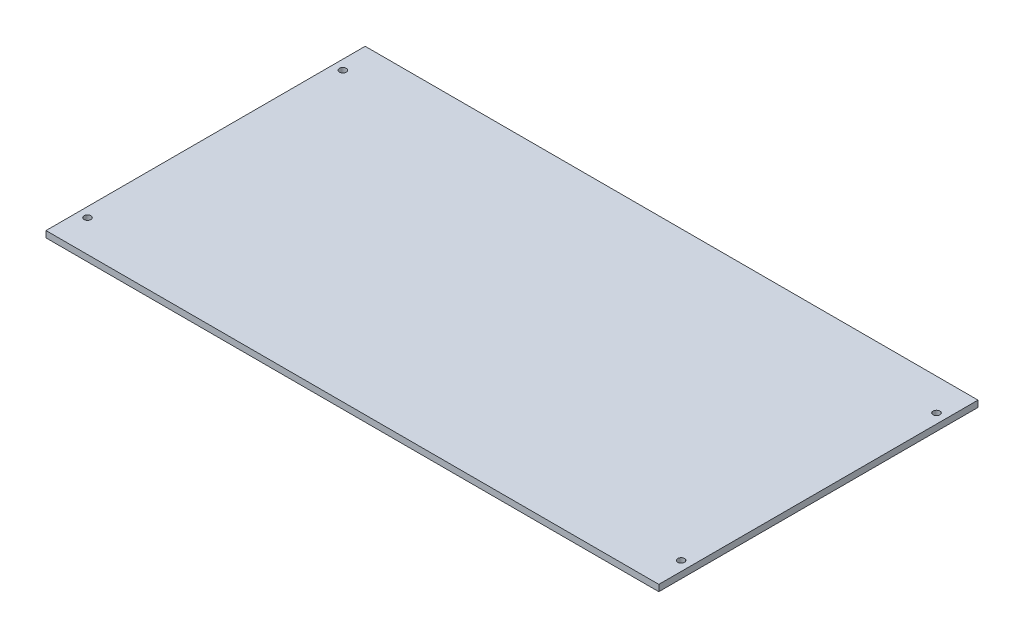
ISO-10303-21;
HEADER;
FILE_DESCRIPTION(('STEP AP214'),'2;1');
FILE_NAME('part.step','',(''),(''),'','','');
FILE_SCHEMA(('AUTOMOTIVE_DESIGN { 1 0 10303 214 1 1 1 1 }'));
ENDSEC;
DATA;
#1=APPLICATION_CONTEXT('core data for automotive mechanical design processes');
#2=APPLICATION_PROTOCOL_DEFINITION('international standard','automotive_design',2000,#1);
#3=PRODUCT_CONTEXT('',#1,'mechanical');
#4=PRODUCT('Part','Part','',(#3));
#5=PRODUCT_RELATED_PRODUCT_CATEGORY('part','',(#4));
#6=PRODUCT_DEFINITION_FORMATION('','',#4);
#7=PRODUCT_DEFINITION_CONTEXT('part definition',#1,'design');
#8=PRODUCT_DEFINITION('design','',#6,#7);
#9=PRODUCT_DEFINITION_SHAPE('','',#8);
#10=(LENGTH_UNIT() NAMED_UNIT(*) SI_UNIT(.MILLI.,.METRE.));
#11=(NAMED_UNIT(*) PLANE_ANGLE_UNIT() SI_UNIT($,.RADIAN.));
#12=(NAMED_UNIT(*) SI_UNIT($,.STERADIAN.) SOLID_ANGLE_UNIT());
#13=UNCERTAINTY_MEASURE_WITH_UNIT(LENGTH_MEASURE(1.E-05),#10,'distance_accuracy_value','');
#14=(GEOMETRIC_REPRESENTATION_CONTEXT(3) GLOBAL_UNCERTAINTY_ASSIGNED_CONTEXT((#13)) GLOBAL_UNIT_ASSIGNED_CONTEXT((#10,
#11,#12)) REPRESENTATION_CONTEXT('',''));
#15=CARTESIAN_POINT('',(0.,0.,0.));
#16=DIRECTION('',(0.,0.,1.));
#17=DIRECTION('',(1.,0.,0.));
#18=AXIS2_PLACEMENT_3D('',#15,#16,#17);
#19=CARTESIAN_POINT('',(0.,0.,0.));
#20=DIRECTION('',(0.,1.,0.));
#21=DIRECTION('',(0.,0.,1.));
#22=AXIS2_PLACEMENT_3D('',#19,#20,#21);
#23=PLANE('',#22);
#24=CARTESIAN_POINT('',(295.275,0.,127.));
#25=DIRECTION('',(0.,-1.,0.));
#26=DIRECTION('',(0.,0.,-1.));
#27=AXIS2_PLACEMENT_3D('',#24,#25,#26);
#28=CIRCLE('',#27,3.3655);
#29=CARTESIAN_POINT('',(295.275,0.,123.6345));
#30=VERTEX_POINT('',#29);
#31=EDGE_CURVE('E89',#30,#30,#28,.F.);
#32=ORIENTED_EDGE('',*,*,#31,.T.);
#33=EDGE_LOOP('',(#32));
#34=FACE_BOUND('',#33,.T.);
#35=CARTESIAN_POINT('',(295.275,0.,-127.));
#36=DIRECTION('',(0.,-1.,0.));
#37=DIRECTION('',(0.,0.,-1.));
#38=AXIS2_PLACEMENT_3D('',#35,#36,#37);
#39=CIRCLE('',#38,3.3655);
#40=CARTESIAN_POINT('',(295.275,0.,-130.3655));
#41=VERTEX_POINT('',#40);
#42=EDGE_CURVE('E93',#41,#41,#39,.F.);
#43=ORIENTED_EDGE('',*,*,#42,.T.);
#44=EDGE_LOOP('',(#43));
#45=FACE_BOUND('',#44,.T.);
#46=CARTESIAN_POINT('',(-295.275,0.,127.));
#47=DIRECTION('',(0.,1.,0.));
#48=DIRECTION('',(0.,0.,1.));
#49=AXIS2_PLACEMENT_3D('',#46,#47,#48);
#50=CIRCLE('',#49,3.3655);
#51=CARTESIAN_POINT('',(-295.275,0.,130.3655));
#52=VERTEX_POINT('',#51);
#53=EDGE_CURVE('E95',#52,#52,#50,.T.);
#54=ORIENTED_EDGE('',*,*,#53,.T.);
#55=EDGE_LOOP('',(#54));
#56=FACE_BOUND('',#55,.T.);
#57=CARTESIAN_POINT('',(-295.275,0.,-127.));
#58=DIRECTION('',(0.,1.,0.));
#59=DIRECTION('',(0.,0.,1.));
#60=AXIS2_PLACEMENT_3D('',#57,#58,#59);
#61=CIRCLE('',#60,3.3655);
#62=CARTESIAN_POINT('',(-295.275,0.,-123.6345));
#63=VERTEX_POINT('',#62);
#64=EDGE_CURVE('E19',#63,#63,#61,.T.);
#65=ORIENTED_EDGE('',*,*,#64,.T.);
#66=EDGE_LOOP('',(#65));
#67=FACE_BOUND('',#66,.T.);
#68=DIRECTION('',(0.,0.,-1.));
#69=VECTOR('',#68,1.);
#70=CARTESIAN_POINT('',(304.8,0.,158.75));
#71=LINE('',#70,#69);
#72=CARTESIAN_POINT('',(304.8,0.,158.75));
#73=VERTEX_POINT('',#72);
#74=CARTESIAN_POINT('',(304.8,0.,-158.75));
#75=VERTEX_POINT('',#74);
#76=EDGE_CURVE('E54',#73,#75,#71,.T.);
#77=ORIENTED_EDGE('',*,*,#76,.F.);
#78=DIRECTION('',(1.,0.,0.));
#79=VECTOR('',#78,1.);
#80=CARTESIAN_POINT('',(-304.8,0.,158.75));
#81=LINE('',#80,#79);
#82=CARTESIAN_POINT('',(-304.8,0.,158.75));
#83=VERTEX_POINT('',#82);
#84=EDGE_CURVE('E59',#83,#73,#81,.T.);
#85=ORIENTED_EDGE('',*,*,#84,.F.);
#86=DIRECTION('',(0.,0.,1.));
#87=VECTOR('',#86,1.);
#88=CARTESIAN_POINT('',(-304.8,0.,-158.75));
#89=LINE('',#88,#87);
#90=CARTESIAN_POINT('',(-304.8,0.,-158.75));
#91=VERTEX_POINT('',#90);
#92=EDGE_CURVE('E100',#91,#83,#89,.T.);
#93=ORIENTED_EDGE('',*,*,#92,.F.);
#94=DIRECTION('',(-1.,0.,0.));
#95=VECTOR('',#94,1.);
#96=CARTESIAN_POINT('',(304.8,0.,-158.75));
#97=LINE('',#96,#95);
#98=EDGE_CURVE('E69',#75,#91,#97,.T.);
#99=ORIENTED_EDGE('',*,*,#98,.F.);
#100=EDGE_LOOP('',(#77,#85,#93,#99));
#101=FACE_BOUND('',#100,.T.);
#102=ADVANCED_FACE('F16',(#34,#45,#56,#67,#101),#23,.F.);
#103=CARTESIAN_POINT('',(-304.8,0.,158.75));
#104=DIRECTION('',(0.,0.,1.));
#105=DIRECTION('',(1.,0.,0.));
#106=AXIS2_PLACEMENT_3D('',#103,#104,#105);
#107=PLANE('',#106);
#108=DIRECTION('',(0.,1.,0.));
#109=VECTOR('',#108,1.);
#110=CARTESIAN_POINT('',(-304.8,0.,158.75));
#111=LINE('',#110,#109);
#112=CARTESIAN_POINT('',(-304.8,6.35,158.75));
#113=VERTEX_POINT('',#112);
#114=EDGE_CURVE('E64',#83,#113,#111,.T.);
#115=ORIENTED_EDGE('',*,*,#114,.F.);
#116=ORIENTED_EDGE('',*,*,#84,.T.);
#117=DIRECTION('',(0.,1.,0.));
#118=VECTOR('',#117,1.);
#119=CARTESIAN_POINT('',(304.8,0.,158.75));
#120=LINE('',#119,#118);
#121=CARTESIAN_POINT('',(304.8,6.35,158.75));
#122=VERTEX_POINT('',#121);
#123=EDGE_CURVE('E61',#122,#73,#120,.F.);
#124=ORIENTED_EDGE('',*,*,#123,.F.);
#125=DIRECTION('',(1.,0.,0.));
#126=VECTOR('',#125,1.);
#127=CARTESIAN_POINT('',(0.,6.35,158.75));
#128=LINE('',#127,#126);
#129=EDGE_CURVE('E92',#113,#122,#128,.T.);
#130=ORIENTED_EDGE('',*,*,#129,.F.);
#131=EDGE_LOOP('',(#115,#116,#124,#130));
#132=FACE_BOUND('',#131,.T.);
#133=ADVANCED_FACE('F60',(#132),#107,.T.);
#134=CARTESIAN_POINT('',(304.8,0.,158.75));
#135=DIRECTION('',(1.,0.,0.));
#136=DIRECTION('',(0.,0.,-1.));
#137=AXIS2_PLACEMENT_3D('',#134,#135,#136);
#138=PLANE('',#137);
#139=ORIENTED_EDGE('',*,*,#123,.T.);
#140=ORIENTED_EDGE('',*,*,#76,.T.);
#141=DIRECTION('',(0.,1.,0.));
#142=VECTOR('',#141,1.);
#143=CARTESIAN_POINT('',(304.8,0.,-158.75));
#144=LINE('',#143,#142);
#145=CARTESIAN_POINT('',(304.8,6.35,-158.75));
#146=VERTEX_POINT('',#145);
#147=EDGE_CURVE('E71',#146,#75,#144,.F.);
#148=ORIENTED_EDGE('',*,*,#147,.F.);
#149=DIRECTION('',(0.,0.,1.));
#150=VECTOR('',#149,1.);
#151=CARTESIAN_POINT('',(304.8,6.35,0.));
#152=LINE('',#151,#150);
#153=EDGE_CURVE('E75',#122,#146,#152,.F.);
#154=ORIENTED_EDGE('',*,*,#153,.F.);
#155=EDGE_LOOP('',(#139,#140,#148,#154));
#156=FACE_BOUND('',#155,.T.);
#157=ADVANCED_FACE('F73',(#156),#138,.T.);
#158=CARTESIAN_POINT('',(304.8,0.,-158.75));
#159=DIRECTION('',(0.,0.,-1.));
#160=DIRECTION('',(-1.,0.,0.));
#161=AXIS2_PLACEMENT_3D('',#158,#159,#160);
#162=PLANE('',#161);
#163=ORIENTED_EDGE('',*,*,#147,.T.);
#164=ORIENTED_EDGE('',*,*,#98,.T.);
#165=DIRECTION('',(0.,1.,0.));
#166=VECTOR('',#165,1.);
#167=CARTESIAN_POINT('',(-304.8,0.,-158.75));
#168=LINE('',#167,#166);
#169=CARTESIAN_POINT('',(-304.8,6.35,-158.75));
#170=VERTEX_POINT('',#169);
#171=EDGE_CURVE('E34',#170,#91,#168,.F.);
#172=ORIENTED_EDGE('',*,*,#171,.F.);
#173=DIRECTION('',(1.,0.,0.));
#174=VECTOR('',#173,1.);
#175=CARTESIAN_POINT('',(0.,6.35,-158.75));
#176=LINE('',#175,#174);
#177=EDGE_CURVE('E112',#146,#170,#176,.F.);
#178=ORIENTED_EDGE('',*,*,#177,.F.);
#179=EDGE_LOOP('',(#163,#164,#172,#178));
#180=FACE_BOUND('',#179,.T.);
#181=ADVANCED_FACE('F110',(#180),#162,.T.);
#182=CARTESIAN_POINT('',(-304.8,0.,-158.75));
#183=DIRECTION('',(-1.,0.,0.));
#184=DIRECTION('',(0.,0.,1.));
#185=AXIS2_PLACEMENT_3D('',#182,#183,#184);
#186=PLANE('',#185);
#187=ORIENTED_EDGE('',*,*,#171,.T.);
#188=ORIENTED_EDGE('',*,*,#92,.T.);
#189=ORIENTED_EDGE('',*,*,#114,.T.);
#190=DIRECTION('',(0.,0.,1.));
#191=VECTOR('',#190,1.);
#192=CARTESIAN_POINT('',(-304.8,6.35,0.));
#193=LINE('',#192,#191);
#194=EDGE_CURVE('E88',#170,#113,#193,.T.);
#195=ORIENTED_EDGE('',*,*,#194,.F.);
#196=EDGE_LOOP('',(#187,#188,#189,#195));
#197=FACE_BOUND('',#196,.T.);
#198=ADVANCED_FACE('F118',(#197),#186,.T.);
#199=CARTESIAN_POINT('',(-295.275,6.35,-127.));
#200=DIRECTION('',(0.,1.,0.));
#201=DIRECTION('',(0.,0.,1.));
#202=AXIS2_PLACEMENT_3D('',#199,#200,#201);
#203=CYLINDRICAL_SURFACE('',#202,3.3655);
#204=CARTESIAN_POINT('',(-295.275,6.35,-127.));
#205=DIRECTION('',(0.,1.,0.));
#206=DIRECTION('',(0.,0.,1.));
#207=AXIS2_PLACEMENT_3D('',#204,#205,#206);
#208=CIRCLE('',#207,3.3655);
#209=CARTESIAN_POINT('',(-295.275,6.35,-123.6345));
#210=VERTEX_POINT('',#209);
#211=EDGE_CURVE('E85',#210,#210,#208,.F.);
#212=ORIENTED_EDGE('',*,*,#211,.F.);
#213=EDGE_LOOP('',(#212));
#214=FACE_BOUND('',#213,.T.);
#215=ORIENTED_EDGE('',*,*,#64,.F.);
#216=EDGE_LOOP('',(#215));
#217=FACE_BOUND('',#216,.T.);
#218=ADVANCED_FACE('F120',(#214,#217),#203,.F.);
#219=CARTESIAN_POINT('',(-295.275,6.35,127.));
#220=DIRECTION('',(0.,1.,0.));
#221=DIRECTION('',(0.,0.,1.));
#222=AXIS2_PLACEMENT_3D('',#219,#220,#221);
#223=CYLINDRICAL_SURFACE('',#222,3.3655);
#224=CARTESIAN_POINT('',(-295.275,6.35,127.));
#225=DIRECTION('',(0.,1.,0.));
#226=DIRECTION('',(0.,0.,1.));
#227=AXIS2_PLACEMENT_3D('',#224,#225,#226);
#228=CIRCLE('',#227,3.3655);
#229=CARTESIAN_POINT('',(-295.275,6.35,130.3655));
#230=VERTEX_POINT('',#229);
#231=EDGE_CURVE('E82',#230,#230,#228,.F.);
#232=ORIENTED_EDGE('',*,*,#231,.F.);
#233=EDGE_LOOP('',(#232));
#234=FACE_BOUND('',#233,.T.);
#235=ORIENTED_EDGE('',*,*,#53,.F.);
#236=EDGE_LOOP('',(#235));
#237=FACE_BOUND('',#236,.T.);
#238=ADVANCED_FACE('F127',(#234,#237),#223,.F.);
#239=CARTESIAN_POINT('',(295.275,6.35,-127.));
#240=DIRECTION('',(0.,-1.,0.));
#241=DIRECTION('',(0.,0.,-1.));
#242=AXIS2_PLACEMENT_3D('',#239,#240,#241);
#243=CYLINDRICAL_SURFACE('',#242,3.3655);
#244=CARTESIAN_POINT('',(295.275,6.35,-127.));
#245=DIRECTION('',(0.,-1.,0.));
#246=DIRECTION('',(0.,0.,-1.));
#247=AXIS2_PLACEMENT_3D('',#244,#245,#246);
#248=CIRCLE('',#247,3.3655);
#249=CARTESIAN_POINT('',(295.275,6.35,-130.3655));
#250=VERTEX_POINT('',#249);
#251=EDGE_CURVE('E25',#250,#250,#248,.T.);
#252=ORIENTED_EDGE('',*,*,#251,.F.);
#253=EDGE_LOOP('',(#252));
#254=FACE_BOUND('',#253,.T.);
#255=ORIENTED_EDGE('',*,*,#42,.F.);
#256=EDGE_LOOP('',(#255));
#257=FACE_BOUND('',#256,.T.);
#258=ADVANCED_FACE('F138',(#254,#257),#243,.F.);
#259=CARTESIAN_POINT('',(295.275,6.35,127.));
#260=DIRECTION('',(0.,-1.,0.));
#261=DIRECTION('',(0.,0.,-1.));
#262=AXIS2_PLACEMENT_3D('',#259,#260,#261);
#263=CYLINDRICAL_SURFACE('',#262,3.3655);
#264=CARTESIAN_POINT('',(295.275,6.35,127.));
#265=DIRECTION('',(0.,-1.,0.));
#266=DIRECTION('',(0.,0.,-1.));
#267=AXIS2_PLACEMENT_3D('',#264,#265,#266);
#268=CIRCLE('',#267,3.3655);
#269=CARTESIAN_POINT('',(295.275,6.35,123.6345));
#270=VERTEX_POINT('',#269);
#271=EDGE_CURVE('E11',#270,#270,#268,.T.);
#272=ORIENTED_EDGE('',*,*,#271,.F.);
#273=EDGE_LOOP('',(#272));
#274=FACE_BOUND('',#273,.T.);
#275=ORIENTED_EDGE('',*,*,#31,.F.);
#276=EDGE_LOOP('',(#275));
#277=FACE_BOUND('',#276,.T.);
#278=ADVANCED_FACE('F132',(#274,#277),#263,.F.);
#279=CARTESIAN_POINT('',(0.,6.35,0.));
#280=DIRECTION('',(0.,1.,0.));
#281=DIRECTION('',(0.,0.,1.));
#282=AXIS2_PLACEMENT_3D('',#279,#280,#281);
#283=PLANE('',#282);
#284=ORIENTED_EDGE('',*,*,#271,.T.);
#285=EDGE_LOOP('',(#284));
#286=FACE_BOUND('',#285,.T.);
#287=ORIENTED_EDGE('',*,*,#251,.T.);
#288=EDGE_LOOP('',(#287));
#289=FACE_BOUND('',#288,.T.);
#290=ORIENTED_EDGE('',*,*,#231,.T.);
#291=EDGE_LOOP('',(#290));
#292=FACE_BOUND('',#291,.T.);
#293=ORIENTED_EDGE('',*,*,#211,.T.);
#294=EDGE_LOOP('',(#293));
#295=FACE_BOUND('',#294,.T.);
#296=ORIENTED_EDGE('',*,*,#177,.T.);
#297=ORIENTED_EDGE('',*,*,#194,.T.);
#298=ORIENTED_EDGE('',*,*,#129,.T.);
#299=ORIENTED_EDGE('',*,*,#153,.T.);
#300=EDGE_LOOP('',(#296,#297,#298,#299));
#301=FACE_BOUND('',#300,.T.);
#302=ADVANCED_FACE('F116',(#286,#289,#292,#295,#301),#283,.T.);
#303=CLOSED_SHELL('',(#102,#133,#157,#181,#198,#218,#238,#258,#278,#302));
#304=MANIFOLD_SOLID_BREP('B1',#303);
#305=ADVANCED_BREP_SHAPE_REPRESENTATION('',(#18,#304),#14);
#306=SHAPE_DEFINITION_REPRESENTATION(#9,#305);
ENDSEC;
END-ISO-10303-21;
